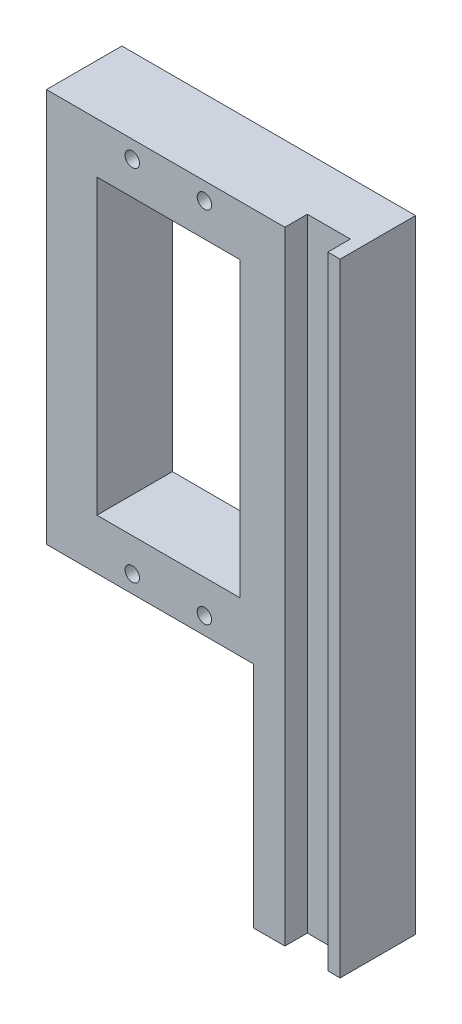
ISO-10303-21;
HEADER;
FILE_DESCRIPTION(('STEP AP214'),'2;1');
FILE_NAME('part.step','',(''),(''),'','','');
FILE_SCHEMA(('AUTOMOTIVE_DESIGN { 1 0 10303 214 1 1 1 1 }'));
ENDSEC;
DATA;
#1=APPLICATION_CONTEXT('core data for automotive mechanical design processes');
#2=APPLICATION_PROTOCOL_DEFINITION('international standard','automotive_design',2000,#1);
#3=PRODUCT_CONTEXT('',#1,'mechanical');
#4=PRODUCT('Part','Part','',(#3));
#5=PRODUCT_RELATED_PRODUCT_CATEGORY('part','',(#4));
#6=PRODUCT_DEFINITION_FORMATION('','',#4);
#7=PRODUCT_DEFINITION_CONTEXT('part definition',#1,'design');
#8=PRODUCT_DEFINITION('design','',#6,#7);
#9=PRODUCT_DEFINITION_SHAPE('','',#8);
#10=(LENGTH_UNIT() NAMED_UNIT(*) SI_UNIT(.MILLI.,.METRE.));
#11=(NAMED_UNIT(*) PLANE_ANGLE_UNIT() SI_UNIT($,.RADIAN.));
#12=(NAMED_UNIT(*) SI_UNIT($,.STERADIAN.) SOLID_ANGLE_UNIT());
#13=UNCERTAINTY_MEASURE_WITH_UNIT(LENGTH_MEASURE(1.E-05),#10,'distance_accuracy_value','');
#14=(GEOMETRIC_REPRESENTATION_CONTEXT(3) GLOBAL_UNCERTAINTY_ASSIGNED_CONTEXT((#13)) GLOBAL_UNIT_ASSIGNED_CONTEXT((#10,
#11,#12)) REPRESENTATION_CONTEXT('',''));
#15=CARTESIAN_POINT('',(0.,0.,0.));
#16=DIRECTION('',(0.,0.,1.));
#17=DIRECTION('',(1.,0.,0.));
#18=AXIS2_PLACEMENT_3D('',#15,#16,#17);
#19=CARTESIAN_POINT('',(0.,0.,10.46));
#20=DIRECTION('',(0.,0.,1.));
#21=DIRECTION('',(1.,0.,0.));
#22=AXIS2_PLACEMENT_3D('',#19,#20,#21);
#23=PLANE('',#22);
#24=CARTESIAN_POINT('',(5.,-24.9,10.46));
#25=DIRECTION('',(0.,0.,1.));
#26=DIRECTION('',(1.,0.,0.));
#27=AXIS2_PLACEMENT_3D('',#24,#25,#26);
#28=CIRCLE('',#27,1.);
#29=CARTESIAN_POINT('',(6.,-24.9,10.46));
#30=VERTEX_POINT('',#29);
#31=EDGE_CURVE('E252',#30,#30,#28,.T.);
#32=ORIENTED_EDGE('',*,*,#31,.F.);
#33=EDGE_LOOP('',(#32));
#34=FACE_BOUND('',#33,.T.);
#35=CARTESIAN_POINT('',(-5.,24.89,10.46));
#36=DIRECTION('',(0.,0.,1.));
#37=DIRECTION('',(1.,0.,0.));
#38=AXIS2_PLACEMENT_3D('',#35,#36,#37);
#39=CIRCLE('',#38,1.);
#40=CARTESIAN_POINT('',(-4.,24.89,10.46));
#41=VERTEX_POINT('',#40);
#42=EDGE_CURVE('E369',#41,#41,#39,.T.);
#43=ORIENTED_EDGE('',*,*,#42,.F.);
#44=EDGE_LOOP('',(#43));
#45=FACE_BOUND('',#44,.T.);
#46=CARTESIAN_POINT('',(5.,24.89,10.46));
#47=DIRECTION('',(0.,0.,1.));
#48=DIRECTION('',(1.,0.,0.));
#49=AXIS2_PLACEMENT_3D('',#46,#47,#48);
#50=CIRCLE('',#49,1.);
#51=CARTESIAN_POINT('',(6.,24.89,10.46));
#52=VERTEX_POINT('',#51);
#53=EDGE_CURVE('E372',#52,#52,#50,.T.);
#54=ORIENTED_EDGE('',*,*,#53,.F.);
#55=EDGE_LOOP('',(#54));
#56=FACE_BOUND('',#55,.T.);
#57=CARTESIAN_POINT('',(-5.,-24.9,10.46));
#58=DIRECTION('',(0.,0.,1.));
#59=DIRECTION('',(1.,0.,0.));
#60=AXIS2_PLACEMENT_3D('',#57,#58,#59);
#61=CIRCLE('',#60,1.);
#62=CARTESIAN_POINT('',(-4.,-24.9,10.46));
#63=VERTEX_POINT('',#62);
#64=EDGE_CURVE('E163',#63,#63,#61,.T.);
#65=ORIENTED_EDGE('',*,*,#64,.F.);
#66=EDGE_LOOP('',(#65));
#67=FACE_BOUND('',#66,.T.);
#68=DIRECTION('',(0.,-1.,0.));
#69=VECTOR('',#68,1.);
#70=CARTESIAN_POINT('',(16.1509101807035,27.3,10.46));
#71=LINE('',#70,#69);
#72=CARTESIAN_POINT('',(16.1509101807035,27.3,10.46));
#73=VERTEX_POINT('',#72);
#74=CARTESIAN_POINT('',(16.1509101807035,-59.0021499848978,10.46));
#75=VERTEX_POINT('',#74);
#76=EDGE_CURVE('E141',#73,#75,#71,.T.);
#77=ORIENTED_EDGE('',*,*,#76,.F.);
#78=DIRECTION('',(-1.,0.,0.));
#79=VECTOR('',#78,1.);
#80=CARTESIAN_POINT('',(-7.90000000000001,27.3,10.46));
#81=LINE('',#80,#79);
#82=CARTESIAN_POINT('',(-16.9,27.3,10.46));
#83=VERTEX_POINT('',#82);
#84=EDGE_CURVE('E209',#73,#83,#81,.T.);
#85=ORIENTED_EDGE('',*,*,#84,.T.);
#86=DIRECTION('',(0.,-1.,0.));
#87=VECTOR('',#86,1.);
#88=CARTESIAN_POINT('',(-16.9,27.3,10.46));
#89=LINE('',#88,#87);
#90=CARTESIAN_POINT('',(-16.9,-27.3,10.46));
#91=VERTEX_POINT('',#90);
#92=EDGE_CURVE('E208',#83,#91,#89,.T.);
#93=ORIENTED_EDGE('',*,*,#92,.T.);
#94=DIRECTION('',(1.,0.,0.));
#95=VECTOR('',#94,1.);
#96=CARTESIAN_POINT('',(-2.175,-27.3,10.46));
#97=LINE('',#96,#95);
#98=CARTESIAN_POINT('',(11.8131026191315,-27.3,10.46));
#99=VERTEX_POINT('',#98);
#100=EDGE_CURVE('E211',#91,#99,#97,.T.);
#101=ORIENTED_EDGE('',*,*,#100,.T.);
#102=DIRECTION('',(0.,-1.,0.));
#103=VECTOR('',#102,1.);
#104=CARTESIAN_POINT('',(11.8131026191315,-27.3,10.46));
#105=LINE('',#104,#103);
#106=CARTESIAN_POINT('',(11.8131026191315,-59.0021499848978,10.46));
#107=VERTEX_POINT('',#106);
#108=EDGE_CURVE('E213',#99,#107,#105,.T.);
#109=ORIENTED_EDGE('',*,*,#108,.T.);
#110=DIRECTION('',(1.,0.,0.));
#111=VECTOR('',#110,1.);
#112=CARTESIAN_POINT('',(11.8131026191315,-59.0021499848978,10.46));
#113=LINE('',#112,#111);
#114=EDGE_CURVE('E216',#107,#75,#113,.T.);
#115=ORIENTED_EDGE('',*,*,#114,.T.);
#116=EDGE_LOOP('',(#77,#85,#93,#101,#109,#115));
#117=FACE_BOUND('',#116,.T.);
#118=DIRECTION('',(1.,0.,0.));
#119=VECTOR('',#118,1.);
#120=CARTESIAN_POINT('',(-9.9,-20.3,10.46));
#121=LINE('',#120,#119);
#122=CARTESIAN_POINT('',(-9.9,-20.3,10.46));
#123=VERTEX_POINT('',#122);
#124=CARTESIAN_POINT('',(9.9,-20.3,10.46));
#125=VERTEX_POINT('',#124);
#126=EDGE_CURVE('E177',#123,#125,#121,.T.);
#127=ORIENTED_EDGE('',*,*,#126,.F.);
#128=DIRECTION('',(0.,-1.,0.));
#129=VECTOR('',#128,1.);
#130=CARTESIAN_POINT('',(-9.9,20.3,10.46));
#131=LINE('',#130,#129);
#132=CARTESIAN_POINT('',(-9.9,20.3,10.46));
#133=VERTEX_POINT('',#132);
#134=EDGE_CURVE('E175',#133,#123,#131,.T.);
#135=ORIENTED_EDGE('',*,*,#134,.F.);
#136=DIRECTION('',(-1.,0.,0.));
#137=VECTOR('',#136,1.);
#138=CARTESIAN_POINT('',(9.9,20.3,10.46));
#139=LINE('',#138,#137);
#140=CARTESIAN_POINT('',(9.9,20.3,10.46));
#141=VERTEX_POINT('',#140);
#142=EDGE_CURVE('E182',#141,#133,#139,.T.);
#143=ORIENTED_EDGE('',*,*,#142,.F.);
#144=DIRECTION('',(0.,1.,0.));
#145=VECTOR('',#144,1.);
#146=CARTESIAN_POINT('',(9.9,-19.3,10.46));
#147=LINE('',#146,#145);
#148=EDGE_CURVE('E180',#125,#141,#147,.T.);
#149=ORIENTED_EDGE('',*,*,#148,.F.);
#150=EDGE_LOOP('',(#127,#135,#143,#149));
#151=FACE_BOUND('',#150,.T.);
#152=ADVANCED_FACE('F33',(#34,#45,#56,#67,#117,#151),#23,.T.);
#153=DIRECTION('',(0.,1.,0.));
#154=VECTOR('',#153,1.);
#155=CARTESIAN_POINT('',(22.1131026191314,-59.0021499848978,10.46));
#156=LINE('',#155,#154);
#157=CARTESIAN_POINT('',(22.1131026191314,-59.0021499848978,10.46));
#158=VERTEX_POINT('',#157);
#159=CARTESIAN_POINT('',(22.1131026191314,27.3,10.46));
#160=VERTEX_POINT('',#159);
#161=EDGE_CURVE('E159',#158,#160,#156,.T.);
#162=ORIENTED_EDGE('',*,*,#161,.F.);
#163=CARTESIAN_POINT('',(23.8131026191315,-59.0021499848978,10.46));
#164=VERTEX_POINT('',#163);
#165=EDGE_CURVE('E215',#158,#164,#113,.T.);
#166=ORIENTED_EDGE('',*,*,#165,.T.);
#167=DIRECTION('',(0.,1.,0.));
#168=VECTOR('',#167,1.);
#169=CARTESIAN_POINT('',(23.8131026191315,-59.0021499848978,10.46));
#170=LINE('',#169,#168);
#171=CARTESIAN_POINT('',(23.8131026191315,27.3,10.46));
#172=VERTEX_POINT('',#171);
#173=EDGE_CURVE('E218',#164,#172,#170,.T.);
#174=ORIENTED_EDGE('',*,*,#173,.T.);
#175=EDGE_CURVE('E205',#172,#160,#81,.T.);
#176=ORIENTED_EDGE('',*,*,#175,.T.);
#177=EDGE_LOOP('',(#162,#166,#174,#176));
#178=FACE_BOUND('',#177,.T.);
#179=ADVANCED_FACE('F267',(#178),#23,.T.);
#180=CARTESIAN_POINT('',(0.,0.,0.));
#181=DIRECTION('',(0.,0.,1.));
#182=DIRECTION('',(1.,0.,0.));
#183=AXIS2_PLACEMENT_3D('',#180,#181,#182);
#184=PLANE('',#183);
#185=CARTESIAN_POINT('',(5.,-24.9,0.));
#186=DIRECTION('',(0.,0.,1.));
#187=DIRECTION('',(1.,0.,0.));
#188=AXIS2_PLACEMENT_3D('',#185,#186,#187);
#189=CIRCLE('',#188,1.);
#190=CARTESIAN_POINT('',(6.,-24.9,0.));
#191=VERTEX_POINT('',#190);
#192=EDGE_CURVE('E37',#191,#191,#189,.T.);
#193=ORIENTED_EDGE('',*,*,#192,.T.);
#194=EDGE_LOOP('',(#193));
#195=FACE_BOUND('',#194,.T.);
#196=CARTESIAN_POINT('',(-5.,24.89,0.));
#197=DIRECTION('',(0.,0.,1.));
#198=DIRECTION('',(1.,0.,0.));
#199=AXIS2_PLACEMENT_3D('',#196,#197,#198);
#200=CIRCLE('',#199,1.);
#201=CARTESIAN_POINT('',(-4.,24.89,0.));
#202=VERTEX_POINT('',#201);
#203=EDGE_CURVE('E251',#202,#202,#200,.T.);
#204=ORIENTED_EDGE('',*,*,#203,.T.);
#205=EDGE_LOOP('',(#204));
#206=FACE_BOUND('',#205,.T.);
#207=CARTESIAN_POINT('',(5.,24.89,0.));
#208=DIRECTION('',(0.,0.,1.));
#209=DIRECTION('',(1.,0.,0.));
#210=AXIS2_PLACEMENT_3D('',#207,#208,#209);
#211=CIRCLE('',#210,1.);
#212=CARTESIAN_POINT('',(6.,24.89,0.));
#213=VERTEX_POINT('',#212);
#214=EDGE_CURVE('E249',#213,#213,#211,.T.);
#215=ORIENTED_EDGE('',*,*,#214,.T.);
#216=EDGE_LOOP('',(#215));
#217=FACE_BOUND('',#216,.T.);
#218=CARTESIAN_POINT('',(-5.,-24.9,0.));
#219=DIRECTION('',(0.,0.,1.));
#220=DIRECTION('',(1.,0.,0.));
#221=AXIS2_PLACEMENT_3D('',#218,#219,#220);
#222=CIRCLE('',#221,1.);
#223=CARTESIAN_POINT('',(-4.,-24.9,0.));
#224=VERTEX_POINT('',#223);
#225=EDGE_CURVE('E168',#224,#224,#222,.T.);
#226=ORIENTED_EDGE('',*,*,#225,.T.);
#227=EDGE_LOOP('',(#226));
#228=FACE_BOUND('',#227,.T.);
#229=DIRECTION('',(0.,-1.,0.));
#230=VECTOR('',#229,1.);
#231=CARTESIAN_POINT('',(-16.9,27.3,0.));
#232=LINE('',#231,#230);
#233=CARTESIAN_POINT('',(-16.9,27.3,0.));
#234=VERTEX_POINT('',#233);
#235=CARTESIAN_POINT('',(-16.9,-27.3,0.));
#236=VERTEX_POINT('',#235);
#237=EDGE_CURVE('E204',#234,#236,#232,.T.);
#238=ORIENTED_EDGE('',*,*,#237,.F.);
#239=DIRECTION('',(-1.,0.,0.));
#240=VECTOR('',#239,1.);
#241=CARTESIAN_POINT('',(-7.90000000000001,27.3,0.));
#242=LINE('',#241,#240);
#243=CARTESIAN_POINT('',(23.8131026191315,27.3,0.));
#244=VERTEX_POINT('',#243);
#245=EDGE_CURVE('E232',#244,#234,#242,.T.);
#246=ORIENTED_EDGE('',*,*,#245,.F.);
#247=DIRECTION('',(0.,1.,0.));
#248=VECTOR('',#247,1.);
#249=CARTESIAN_POINT('',(23.8131026191315,-59.0021499848978,0.));
#250=LINE('',#249,#248);
#251=CARTESIAN_POINT('',(23.8131026191315,-59.0021499848978,0.));
#252=VERTEX_POINT('',#251);
#253=EDGE_CURVE('E230',#252,#244,#250,.T.);
#254=ORIENTED_EDGE('',*,*,#253,.F.);
#255=DIRECTION('',(1.,0.,0.));
#256=VECTOR('',#255,1.);
#257=CARTESIAN_POINT('',(11.8131026191315,-59.0021499848978,0.));
#258=LINE('',#257,#256);
#259=CARTESIAN_POINT('',(11.8131026191315,-59.0021499848978,0.));
#260=VERTEX_POINT('',#259);
#261=EDGE_CURVE('E228',#260,#252,#258,.T.);
#262=ORIENTED_EDGE('',*,*,#261,.F.);
#263=DIRECTION('',(0.,-1.,0.));
#264=VECTOR('',#263,1.);
#265=CARTESIAN_POINT('',(11.8131026191315,-27.3,0.));
#266=LINE('',#265,#264);
#267=CARTESIAN_POINT('',(11.8131026191315,-27.3,0.));
#268=VERTEX_POINT('',#267);
#269=EDGE_CURVE('E226',#268,#260,#266,.T.);
#270=ORIENTED_EDGE('',*,*,#269,.F.);
#271=DIRECTION('',(1.,0.,0.));
#272=VECTOR('',#271,1.);
#273=CARTESIAN_POINT('',(-2.175,-27.3,0.));
#274=LINE('',#273,#272);
#275=EDGE_CURVE('E224',#236,#268,#274,.T.);
#276=ORIENTED_EDGE('',*,*,#275,.F.);
#277=EDGE_LOOP('',(#238,#246,#254,#262,#270,#276));
#278=FACE_BOUND('',#277,.T.);
#279=DIRECTION('',(0.,-1.,0.));
#280=VECTOR('',#279,1.);
#281=CARTESIAN_POINT('',(-9.9,20.3,0.));
#282=LINE('',#281,#280);
#283=CARTESIAN_POINT('',(-9.9,20.3,0.));
#284=VERTEX_POINT('',#283);
#285=CARTESIAN_POINT('',(-9.9,-20.3,0.));
#286=VERTEX_POINT('',#285);
#287=EDGE_CURVE('E146',#284,#286,#282,.T.);
#288=ORIENTED_EDGE('',*,*,#287,.T.);
#289=DIRECTION('',(1.,0.,0.));
#290=VECTOR('',#289,1.);
#291=CARTESIAN_POINT('',(-9.9,-20.3,0.));
#292=LINE('',#291,#290);
#293=CARTESIAN_POINT('',(9.9,-20.3,0.));
#294=VERTEX_POINT('',#293);
#295=EDGE_CURVE('E187',#286,#294,#292,.T.);
#296=ORIENTED_EDGE('',*,*,#295,.T.);
#297=DIRECTION('',(0.,1.,0.));
#298=VECTOR('',#297,1.);
#299=CARTESIAN_POINT('',(9.9,-19.3,0.));
#300=LINE('',#299,#298);
#301=CARTESIAN_POINT('',(9.9,20.3,0.));
#302=VERTEX_POINT('',#301);
#303=EDGE_CURVE('E190',#294,#302,#300,.T.);
#304=ORIENTED_EDGE('',*,*,#303,.T.);
#305=DIRECTION('',(-1.,0.,0.));
#306=VECTOR('',#305,1.);
#307=CARTESIAN_POINT('',(9.9,20.3,0.));
#308=LINE('',#307,#306);
#309=EDGE_CURVE('E178',#302,#284,#308,.T.);
#310=ORIENTED_EDGE('',*,*,#309,.T.);
#311=EDGE_LOOP('',(#288,#296,#304,#310));
#312=FACE_BOUND('',#311,.T.);
#313=ADVANCED_FACE('F283',(#195,#206,#217,#228,#278,#312),#184,.F.);
#314=CARTESIAN_POINT('',(-16.9,27.3,10.46));
#315=DIRECTION('',(1.,0.,0.));
#316=DIRECTION('',(0.,0.,-1.));
#317=AXIS2_PLACEMENT_3D('',#314,#315,#316);
#318=PLANE('',#317);
#319=ORIENTED_EDGE('',*,*,#237,.T.);
#320=DIRECTION('',(0.,0.,-1.));
#321=VECTOR('',#320,1.);
#322=CARTESIAN_POINT('',(-16.9,-27.3,10.46));
#323=LINE('',#322,#321);
#324=EDGE_CURVE('E42',#91,#236,#323,.T.);
#325=ORIENTED_EDGE('',*,*,#324,.F.);
#326=ORIENTED_EDGE('',*,*,#92,.F.);
#327=DIRECTION('',(0.,0.,-1.));
#328=VECTOR('',#327,1.);
#329=CARTESIAN_POINT('',(-16.9,27.3,10.46));
#330=LINE('',#329,#328);
#331=EDGE_CURVE('E11',#83,#234,#330,.T.);
#332=ORIENTED_EDGE('',*,*,#331,.T.);
#333=EDGE_LOOP('',(#319,#325,#326,#332));
#334=FACE_BOUND('',#333,.T.);
#335=ADVANCED_FACE('F35',(#334),#318,.F.);
#336=CARTESIAN_POINT('',(-2.175,-27.3,10.46));
#337=DIRECTION('',(0.,1.,0.));
#338=DIRECTION('',(0.,0.,1.));
#339=AXIS2_PLACEMENT_3D('',#336,#337,#338);
#340=PLANE('',#339);
#341=ORIENTED_EDGE('',*,*,#275,.T.);
#342=DIRECTION('',(0.,0.,-1.));
#343=VECTOR('',#342,1.);
#344=CARTESIAN_POINT('',(11.8131026191315,-27.3,10.46));
#345=LINE('',#344,#343);
#346=EDGE_CURVE('E242',#99,#268,#345,.T.);
#347=ORIENTED_EDGE('',*,*,#346,.F.);
#348=ORIENTED_EDGE('',*,*,#100,.F.);
#349=ORIENTED_EDGE('',*,*,#324,.T.);
#350=EDGE_LOOP('',(#341,#347,#348,#349));
#351=FACE_BOUND('',#350,.T.);
#352=ADVANCED_FACE('F319',(#351),#340,.F.);
#353=CARTESIAN_POINT('',(11.8131026191315,-27.3,10.46));
#354=DIRECTION('',(1.,0.,0.));
#355=DIRECTION('',(0.,0.,-1.));
#356=AXIS2_PLACEMENT_3D('',#353,#354,#355);
#357=PLANE('',#356);
#358=ORIENTED_EDGE('',*,*,#269,.T.);
#359=DIRECTION('',(0.,0.,-1.));
#360=VECTOR('',#359,1.);
#361=CARTESIAN_POINT('',(11.8131026191315,-59.0021499848978,10.46));
#362=LINE('',#361,#360);
#363=EDGE_CURVE('E239',#107,#260,#362,.T.);
#364=ORIENTED_EDGE('',*,*,#363,.F.);
#365=ORIENTED_EDGE('',*,*,#108,.F.);
#366=ORIENTED_EDGE('',*,*,#346,.T.);
#367=EDGE_LOOP('',(#358,#364,#365,#366));
#368=FACE_BOUND('',#367,.T.);
#369=ADVANCED_FACE('F317',(#368),#357,.F.);
#370=CARTESIAN_POINT('',(11.8131026191315,-59.0021499848978,10.46));
#371=DIRECTION('',(0.,1.,0.));
#372=DIRECTION('',(0.,0.,1.));
#373=AXIS2_PLACEMENT_3D('',#370,#371,#372);
#374=PLANE('',#373);
#375=DIRECTION('',(-1.,0.,0.));
#376=VECTOR('',#375,1.);
#377=CARTESIAN_POINT('',(17.8131026191315,-59.0021499848978,7.34));
#378=LINE('',#377,#376);
#379=CARTESIAN_POINT('',(22.1131026191314,-59.0021499848978,7.34));
#380=VERTEX_POINT('',#379);
#381=CARTESIAN_POINT('',(16.1509101807035,-59.0021499848978,7.34));
#382=VERTEX_POINT('',#381);
#383=EDGE_CURVE('E150',#380,#382,#378,.T.);
#384=ORIENTED_EDGE('',*,*,#383,.T.);
#385=DIRECTION('',(0.,0.,1.));
#386=VECTOR('',#385,1.);
#387=CARTESIAN_POINT('',(16.1509101807035,-59.0021499848978,7.34));
#388=LINE('',#387,#386);
#389=EDGE_CURVE('E136',#382,#75,#388,.T.);
#390=ORIENTED_EDGE('',*,*,#389,.T.);
#391=ORIENTED_EDGE('',*,*,#114,.F.);
#392=ORIENTED_EDGE('',*,*,#363,.T.);
#393=ORIENTED_EDGE('',*,*,#261,.T.);
#394=DIRECTION('',(0.,0.,-1.));
#395=VECTOR('',#394,1.);
#396=CARTESIAN_POINT('',(23.8131026191315,-59.0021499848978,10.46));
#397=LINE('',#396,#395);
#398=EDGE_CURVE('E236',#164,#252,#397,.T.);
#399=ORIENTED_EDGE('',*,*,#398,.F.);
#400=ORIENTED_EDGE('',*,*,#165,.F.);
#401=DIRECTION('',(0.,0.,1.));
#402=VECTOR('',#401,1.);
#403=CARTESIAN_POINT('',(22.1131026191314,-59.0021499848978,7.34));
#404=LINE('',#403,#402);
#405=EDGE_CURVE('E158',#380,#158,#404,.T.);
#406=ORIENTED_EDGE('',*,*,#405,.F.);
#407=EDGE_LOOP('',(#384,#390,#391,#392,#393,#399,#400,#406));
#408=FACE_BOUND('',#407,.T.);
#409=ADVANCED_FACE('F156',(#408),#374,.F.);
#410=CARTESIAN_POINT('',(23.8131026191315,-59.0021499848978,10.46));
#411=DIRECTION('',(-1.,0.,0.));
#412=DIRECTION('',(0.,0.,1.));
#413=AXIS2_PLACEMENT_3D('',#410,#411,#412);
#414=PLANE('',#413);
#415=ORIENTED_EDGE('',*,*,#253,.T.);
#416=DIRECTION('',(0.,0.,-1.));
#417=VECTOR('',#416,1.);
#418=CARTESIAN_POINT('',(23.8131026191315,27.3,10.46));
#419=LINE('',#418,#417);
#420=EDGE_CURVE('E221',#172,#244,#419,.T.);
#421=ORIENTED_EDGE('',*,*,#420,.F.);
#422=ORIENTED_EDGE('',*,*,#173,.F.);
#423=ORIENTED_EDGE('',*,*,#398,.T.);
#424=EDGE_LOOP('',(#415,#421,#422,#423));
#425=FACE_BOUND('',#424,.T.);
#426=ADVANCED_FACE('F310',(#425),#414,.F.);
#427=CARTESIAN_POINT('',(-7.90000000000001,27.3,10.46));
#428=DIRECTION('',(0.,-1.,0.));
#429=DIRECTION('',(1.,0.,0.));
#430=AXIS2_PLACEMENT_3D('',#427,#428,#429);
#431=PLANE('',#430);
#432=ORIENTED_EDGE('',*,*,#84,.F.);
#433=DIRECTION('',(0.,0.,1.));
#434=VECTOR('',#433,1.);
#435=CARTESIAN_POINT('',(16.1509101807035,27.3,7.34));
#436=LINE('',#435,#434);
#437=CARTESIAN_POINT('',(16.1509101807035,27.3,7.34));
#438=VERTEX_POINT('',#437);
#439=EDGE_CURVE('E147',#438,#73,#436,.T.);
#440=ORIENTED_EDGE('',*,*,#439,.F.);
#441=DIRECTION('',(-1.,0.,0.));
#442=VECTOR('',#441,1.);
#443=CARTESIAN_POINT('',(17.2,27.3,7.34));
#444=LINE('',#443,#442);
#445=CARTESIAN_POINT('',(22.1131026191314,27.3,7.34));
#446=VERTEX_POINT('',#445);
#447=EDGE_CURVE('E152',#446,#438,#444,.T.);
#448=ORIENTED_EDGE('',*,*,#447,.F.);
#449=DIRECTION('',(0.,0.,1.));
#450=VECTOR('',#449,1.);
#451=CARTESIAN_POINT('',(22.1131026191314,27.3,7.34));
#452=LINE('',#451,#450);
#453=EDGE_CURVE('E171',#446,#160,#452,.T.);
#454=ORIENTED_EDGE('',*,*,#453,.T.);
#455=ORIENTED_EDGE('',*,*,#175,.F.);
#456=ORIENTED_EDGE('',*,*,#420,.T.);
#457=ORIENTED_EDGE('',*,*,#245,.T.);
#458=ORIENTED_EDGE('',*,*,#331,.F.);
#459=EDGE_LOOP('',(#432,#440,#448,#454,#455,#456,#457,#458));
#460=FACE_BOUND('',#459,.T.);
#461=ADVANCED_FACE('F302',(#460),#431,.F.);
#462=CARTESIAN_POINT('',(-9.9,20.3,10.46));
#463=DIRECTION('',(1.,0.,0.));
#464=DIRECTION('',(0.,0.,-1.));
#465=AXIS2_PLACEMENT_3D('',#462,#463,#464);
#466=PLANE('',#465);
#467=ORIENTED_EDGE('',*,*,#287,.F.);
#468=DIRECTION('',(0.,0.,-1.));
#469=VECTOR('',#468,1.);
#470=CARTESIAN_POINT('',(-9.9,20.3,10.46));
#471=LINE('',#470,#469);
#472=EDGE_CURVE('E184',#133,#284,#471,.T.);
#473=ORIENTED_EDGE('',*,*,#472,.F.);
#474=ORIENTED_EDGE('',*,*,#134,.T.);
#475=DIRECTION('',(0.,0.,-1.));
#476=VECTOR('',#475,1.);
#477=CARTESIAN_POINT('',(-9.9,-20.3,10.46));
#478=LINE('',#477,#476);
#479=EDGE_CURVE('E201',#123,#286,#478,.T.);
#480=ORIENTED_EDGE('',*,*,#479,.T.);
#481=EDGE_LOOP('',(#467,#473,#474,#480));
#482=FACE_BOUND('',#481,.T.);
#483=ADVANCED_FACE('F285',(#482),#466,.T.);
#484=CARTESIAN_POINT('',(-9.9,-20.3,10.46));
#485=DIRECTION('',(0.,1.,0.));
#486=DIRECTION('',(0.,0.,1.));
#487=AXIS2_PLACEMENT_3D('',#484,#485,#486);
#488=PLANE('',#487);
#489=ORIENTED_EDGE('',*,*,#295,.F.);
#490=ORIENTED_EDGE('',*,*,#479,.F.);
#491=ORIENTED_EDGE('',*,*,#126,.T.);
#492=DIRECTION('',(0.,0.,-1.));
#493=VECTOR('',#492,1.);
#494=CARTESIAN_POINT('',(9.9,-20.3,10.46));
#495=LINE('',#494,#493);
#496=EDGE_CURVE('E198',#125,#294,#495,.T.);
#497=ORIENTED_EDGE('',*,*,#496,.T.);
#498=EDGE_LOOP('',(#489,#490,#491,#497));
#499=FACE_BOUND('',#498,.T.);
#500=ADVANCED_FACE('F279',(#499),#488,.T.);
#501=CARTESIAN_POINT('',(9.9,-19.3,10.46));
#502=DIRECTION('',(-1.,0.,0.));
#503=DIRECTION('',(0.,0.,1.));
#504=AXIS2_PLACEMENT_3D('',#501,#502,#503);
#505=PLANE('',#504);
#506=ORIENTED_EDGE('',*,*,#303,.F.);
#507=ORIENTED_EDGE('',*,*,#496,.F.);
#508=ORIENTED_EDGE('',*,*,#148,.T.);
#509=DIRECTION('',(0.,0.,-1.));
#510=VECTOR('',#509,1.);
#511=CARTESIAN_POINT('',(9.9,20.3,10.46));
#512=LINE('',#511,#510);
#513=EDGE_CURVE('E58',#141,#302,#512,.T.);
#514=ORIENTED_EDGE('',*,*,#513,.T.);
#515=EDGE_LOOP('',(#506,#507,#508,#514));
#516=FACE_BOUND('',#515,.T.);
#517=ADVANCED_FACE('F281',(#516),#505,.T.);
#518=CARTESIAN_POINT('',(9.9,20.3,10.46));
#519=DIRECTION('',(0.,-1.,0.));
#520=DIRECTION('',(0.,0.,-1.));
#521=AXIS2_PLACEMENT_3D('',#518,#519,#520);
#522=PLANE('',#521);
#523=ORIENTED_EDGE('',*,*,#309,.F.);
#524=ORIENTED_EDGE('',*,*,#513,.F.);
#525=ORIENTED_EDGE('',*,*,#142,.T.);
#526=ORIENTED_EDGE('',*,*,#472,.T.);
#527=EDGE_LOOP('',(#523,#524,#525,#526));
#528=FACE_BOUND('',#527,.T.);
#529=ADVANCED_FACE('F287',(#528),#522,.T.);
#530=CARTESIAN_POINT('',(16.1509101807035,27.3,7.34));
#531=DIRECTION('',(-1.,0.,0.));
#532=DIRECTION('',(0.,0.,1.));
#533=AXIS2_PLACEMENT_3D('',#530,#531,#532);
#534=PLANE('',#533);
#535=ORIENTED_EDGE('',*,*,#76,.T.);
#536=ORIENTED_EDGE('',*,*,#389,.F.);
#537=DIRECTION('',(0.,-1.,0.));
#538=VECTOR('',#537,1.);
#539=CARTESIAN_POINT('',(16.1509101807035,27.3,7.34));
#540=LINE('',#539,#538);
#541=EDGE_CURVE('E139',#438,#382,#540,.T.);
#542=ORIENTED_EDGE('',*,*,#541,.F.);
#543=ORIENTED_EDGE('',*,*,#439,.T.);
#544=EDGE_LOOP('',(#535,#536,#542,#543));
#545=FACE_BOUND('',#544,.T.);
#546=ADVANCED_FACE('F138',(#545),#534,.F.);
#547=CARTESIAN_POINT('',(22.1131026191314,-59.0021499848978,7.34));
#548=DIRECTION('',(1.,0.,0.));
#549=DIRECTION('',(0.,0.,-1.));
#550=AXIS2_PLACEMENT_3D('',#547,#548,#549);
#551=PLANE('',#550);
#552=ORIENTED_EDGE('',*,*,#161,.T.);
#553=ORIENTED_EDGE('',*,*,#453,.F.);
#554=DIRECTION('',(0.,1.,0.));
#555=VECTOR('',#554,1.);
#556=CARTESIAN_POINT('',(22.1131026191314,-59.0021499848978,7.34));
#557=LINE('',#556,#555);
#558=EDGE_CURVE('E50',#380,#446,#557,.T.);
#559=ORIENTED_EDGE('',*,*,#558,.F.);
#560=ORIENTED_EDGE('',*,*,#405,.T.);
#561=EDGE_LOOP('',(#552,#553,#559,#560));
#562=FACE_BOUND('',#561,.T.);
#563=ADVANCED_FACE('F294',(#562),#551,.F.);
#564=CARTESIAN_POINT('',(0.,0.,7.34));
#565=DIRECTION('',(0.,0.,1.));
#566=DIRECTION('',(1.,0.,0.));
#567=AXIS2_PLACEMENT_3D('',#564,#565,#566);
#568=PLANE('',#567);
#569=ORIENTED_EDGE('',*,*,#383,.F.);
#570=ORIENTED_EDGE('',*,*,#558,.T.);
#571=ORIENTED_EDGE('',*,*,#447,.T.);
#572=ORIENTED_EDGE('',*,*,#541,.T.);
#573=EDGE_LOOP('',(#569,#570,#571,#572));
#574=FACE_BOUND('',#573,.T.);
#575=ADVANCED_FACE('F149',(#574),#568,.T.);
#576=CARTESIAN_POINT('',(-5.,-24.9,-9.54));
#577=DIRECTION('',(0.,0.,1.));
#578=DIRECTION('',(1.,0.,0.));
#579=AXIS2_PLACEMENT_3D('',#576,#577,#578);
#580=CYLINDRICAL_SURFACE('',#579,1.);
#581=ORIENTED_EDGE('',*,*,#64,.T.);
#582=EDGE_LOOP('',(#581));
#583=FACE_BOUND('',#582,.T.);
#584=ORIENTED_EDGE('',*,*,#225,.F.);
#585=EDGE_LOOP('',(#584));
#586=FACE_BOUND('',#585,.T.);
#587=ADVANCED_FACE('F262',(#583,#586),#580,.F.);
#588=CARTESIAN_POINT('',(5.,24.89,-9.54));
#589=DIRECTION('',(0.,0.,1.));
#590=DIRECTION('',(1.,0.,0.));
#591=AXIS2_PLACEMENT_3D('',#588,#589,#590);
#592=CYLINDRICAL_SURFACE('',#591,1.);
#593=ORIENTED_EDGE('',*,*,#53,.T.);
#594=EDGE_LOOP('',(#593));
#595=FACE_BOUND('',#594,.T.);
#596=ORIENTED_EDGE('',*,*,#214,.F.);
#597=EDGE_LOOP('',(#596));
#598=FACE_BOUND('',#597,.T.);
#599=ADVANCED_FACE('F353',(#595,#598),#592,.F.);
#600=CARTESIAN_POINT('',(-5.,24.89,-9.54));
#601=DIRECTION('',(0.,0.,1.));
#602=DIRECTION('',(1.,0.,0.));
#603=AXIS2_PLACEMENT_3D('',#600,#601,#602);
#604=CYLINDRICAL_SURFACE('',#603,1.);
#605=ORIENTED_EDGE('',*,*,#42,.T.);
#606=EDGE_LOOP('',(#605));
#607=FACE_BOUND('',#606,.T.);
#608=ORIENTED_EDGE('',*,*,#203,.F.);
#609=EDGE_LOOP('',(#608));
#610=FACE_BOUND('',#609,.T.);
#611=ADVANCED_FACE('F356',(#607,#610),#604,.F.);
#612=CARTESIAN_POINT('',(5.,-24.9,-9.54));
#613=DIRECTION('',(0.,0.,1.));
#614=DIRECTION('',(1.,0.,0.));
#615=AXIS2_PLACEMENT_3D('',#612,#613,#614);
#616=CYLINDRICAL_SURFACE('',#615,1.);
#617=ORIENTED_EDGE('',*,*,#31,.T.);
#618=EDGE_LOOP('',(#617));
#619=FACE_BOUND('',#618,.T.);
#620=ORIENTED_EDGE('',*,*,#192,.F.);
#621=EDGE_LOOP('',(#620));
#622=FACE_BOUND('',#621,.T.);
#623=ADVANCED_FACE('F360',(#619,#622),#616,.F.);
#624=CLOSED_SHELL('',(#152,#179,#313,#335,#352,#369,#409,#426,#461,#483,#500,#517,#529,#546,
#563,#575,#587,#599,#611,#623));
#625=MANIFOLD_SOLID_BREP('B2',#624);
#626=ADVANCED_BREP_SHAPE_REPRESENTATION('',(#18,#625),#14);
#627=SHAPE_DEFINITION_REPRESENTATION(#9,#626);
ENDSEC;
END-ISO-10303-21;
